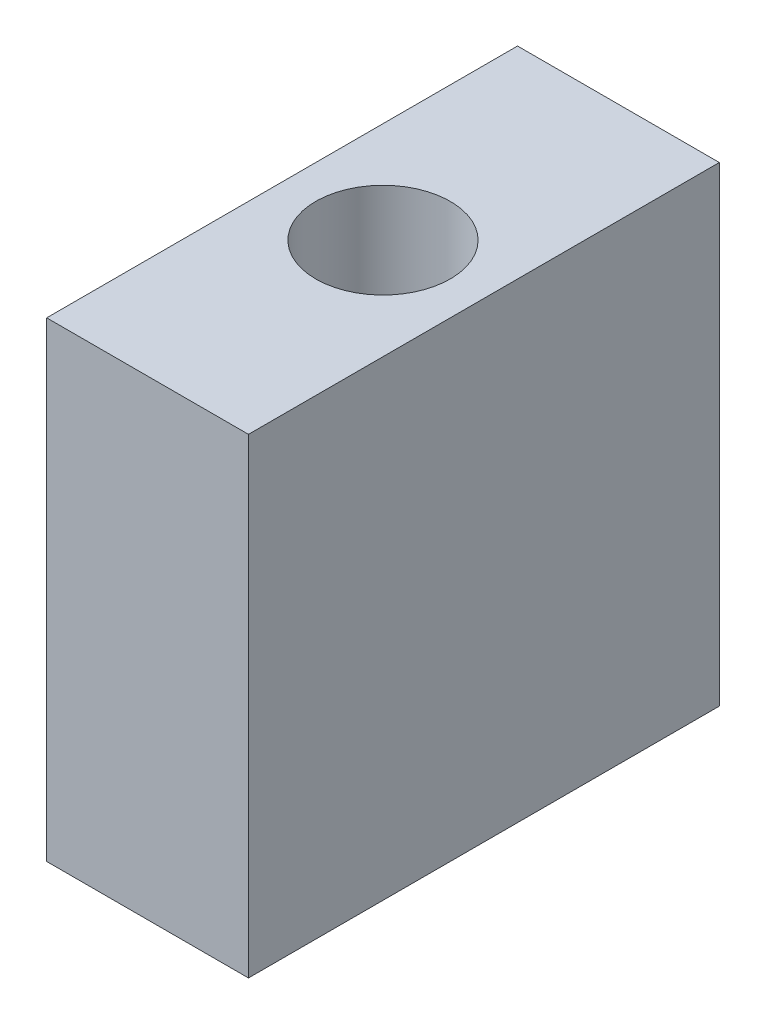
ISO-10303-21;
HEADER;
FILE_DESCRIPTION(('STEP AP214'),'2;1');
FILE_NAME('part.step','',(''),(''),'','','');
FILE_SCHEMA(('AUTOMOTIVE_DESIGN { 1 0 10303 214 1 1 1 1 }'));
ENDSEC;
DATA;
#1=APPLICATION_CONTEXT('core data for automotive mechanical design processes');
#2=APPLICATION_PROTOCOL_DEFINITION('international standard','automotive_design',2000,#1);
#3=PRODUCT_CONTEXT('',#1,'mechanical');
#4=PRODUCT('Part','Part','',(#3));
#5=PRODUCT_RELATED_PRODUCT_CATEGORY('part','',(#4));
#6=PRODUCT_DEFINITION_FORMATION('','',#4);
#7=PRODUCT_DEFINITION_CONTEXT('part definition',#1,'design');
#8=PRODUCT_DEFINITION('design','',#6,#7);
#9=PRODUCT_DEFINITION_SHAPE('','',#8);
#10=(LENGTH_UNIT() NAMED_UNIT(*) SI_UNIT(.MILLI.,.METRE.));
#11=(NAMED_UNIT(*) PLANE_ANGLE_UNIT() SI_UNIT($,.RADIAN.));
#12=(NAMED_UNIT(*) SI_UNIT($,.STERADIAN.) SOLID_ANGLE_UNIT());
#13=UNCERTAINTY_MEASURE_WITH_UNIT(LENGTH_MEASURE(1.E-05),#10,'distance_accuracy_value','');
#14=(GEOMETRIC_REPRESENTATION_CONTEXT(3) GLOBAL_UNCERTAINTY_ASSIGNED_CONTEXT((#13)) GLOBAL_UNIT_ASSIGNED_CONTEXT((#10,
#11,#12)) REPRESENTATION_CONTEXT('',''));
#15=CARTESIAN_POINT('',(0.,0.,0.));
#16=DIRECTION('',(0.,0.,1.));
#17=DIRECTION('',(1.,0.,0.));
#18=AXIS2_PLACEMENT_3D('',#15,#16,#17);
#19=CARTESIAN_POINT('',(0.,7.,0.));
#20=DIRECTION('',(0.,1.,0.));
#21=DIRECTION('',(0.,0.,1.));
#22=AXIS2_PLACEMENT_3D('',#19,#20,#21);
#23=PLANE('',#22);
#24=DIRECTION('',(0.,0.,-1.));
#25=VECTOR('',#24,1.);
#26=CARTESIAN_POINT('',(1.5,7.,-3.5));
#27=LINE('',#26,#25);
#28=CARTESIAN_POINT('',(1.5,7.,3.5));
#29=VERTEX_POINT('',#28);
#30=CARTESIAN_POINT('',(1.5,7.,-3.5));
#31=VERTEX_POINT('',#30);
#32=EDGE_CURVE('E91',#29,#31,#27,.T.);
#33=ORIENTED_EDGE('',*,*,#32,.T.);
#34=DIRECTION('',(-1.,0.,0.));
#35=VECTOR('',#34,1.);
#36=CARTESIAN_POINT('',(-1.5,7.,-3.5));
#37=LINE('',#36,#35);
#38=CARTESIAN_POINT('',(-1.5,7.,-3.5));
#39=VERTEX_POINT('',#38);
#40=EDGE_CURVE('E86',#31,#39,#37,.T.);
#41=ORIENTED_EDGE('',*,*,#40,.T.);
#42=DIRECTION('',(0.,0.,1.));
#43=VECTOR('',#42,1.);
#44=CARTESIAN_POINT('',(-1.5,7.,-3.5));
#45=LINE('',#44,#43);
#46=CARTESIAN_POINT('',(-1.5,7.,3.5));
#47=VERTEX_POINT('',#46);
#48=EDGE_CURVE('E89',#39,#47,#45,.T.);
#49=ORIENTED_EDGE('',*,*,#48,.T.);
#50=DIRECTION('',(1.,0.,0.));
#51=VECTOR('',#50,1.);
#52=CARTESIAN_POINT('',(-1.5,7.,3.5));
#53=LINE('',#52,#51);
#54=EDGE_CURVE('E56',#47,#29,#53,.T.);
#55=ORIENTED_EDGE('',*,*,#54,.T.);
#56=EDGE_LOOP('',(#33,#41,#49,#55));
#57=FACE_BOUND('',#56,.T.);
#58=CARTESIAN_POINT('',(0.,7.,0.));
#59=DIRECTION('',(0.,1.,0.));
#60=DIRECTION('',(0.,0.,1.));
#61=AXIS2_PLACEMENT_3D('',#58,#59,#60);
#62=CIRCLE('',#61,1.);
#63=CARTESIAN_POINT('',(0.,7.,1.));
#64=VERTEX_POINT('',#63);
#65=EDGE_CURVE('E106',#64,#64,#62,.T.);
#66=ORIENTED_EDGE('',*,*,#65,.F.);
#67=EDGE_LOOP('',(#66));
#68=FACE_BOUND('',#67,.T.);
#69=ADVANCED_FACE('F39',(#57,#68),#23,.T.);
#70=CARTESIAN_POINT('',(0.,0.,0.));
#71=DIRECTION('',(0.,1.,0.));
#72=DIRECTION('',(0.,0.,1.));
#73=AXIS2_PLACEMENT_3D('',#70,#71,#72);
#74=PLANE('',#73);
#75=DIRECTION('',(0.,0.,-1.));
#76=VECTOR('',#75,1.);
#77=CARTESIAN_POINT('',(1.5,0.,-3.5));
#78=LINE('',#77,#76);
#79=CARTESIAN_POINT('',(1.5,0.,3.5));
#80=VERTEX_POINT('',#79);
#81=CARTESIAN_POINT('',(1.5,0.,-3.5));
#82=VERTEX_POINT('',#81);
#83=EDGE_CURVE('E103',#80,#82,#78,.T.);
#84=ORIENTED_EDGE('',*,*,#83,.F.);
#85=DIRECTION('',(1.,0.,0.));
#86=VECTOR('',#85,1.);
#87=CARTESIAN_POINT('',(-1.5,0.,3.5));
#88=LINE('',#87,#86);
#89=CARTESIAN_POINT('',(-1.5,0.,3.5));
#90=VERTEX_POINT('',#89);
#91=EDGE_CURVE('E79',#90,#80,#88,.T.);
#92=ORIENTED_EDGE('',*,*,#91,.F.);
#93=DIRECTION('',(0.,0.,1.));
#94=VECTOR('',#93,1.);
#95=CARTESIAN_POINT('',(-1.5,0.,-3.5));
#96=LINE('',#95,#94);
#97=CARTESIAN_POINT('',(-1.5,0.,-3.5));
#98=VERTEX_POINT('',#97);
#99=EDGE_CURVE('E73',#98,#90,#96,.T.);
#100=ORIENTED_EDGE('',*,*,#99,.F.);
#101=DIRECTION('',(-1.,0.,0.));
#102=VECTOR('',#101,1.);
#103=CARTESIAN_POINT('',(-1.5,0.,-3.5));
#104=LINE('',#103,#102);
#105=EDGE_CURVE('E95',#82,#98,#104,.T.);
#106=ORIENTED_EDGE('',*,*,#105,.F.);
#107=EDGE_LOOP('',(#84,#92,#100,#106));
#108=FACE_BOUND('',#107,.T.);
#109=CARTESIAN_POINT('',(0.,0.,0.));
#110=DIRECTION('',(0.,1.,0.));
#111=DIRECTION('',(0.,0.,1.));
#112=AXIS2_PLACEMENT_3D('',#109,#110,#111);
#113=CIRCLE('',#112,1.);
#114=CARTESIAN_POINT('',(0.,0.,1.));
#115=VERTEX_POINT('',#114);
#116=EDGE_CURVE('E118',#115,#115,#113,.T.);
#117=ORIENTED_EDGE('',*,*,#116,.T.);
#118=EDGE_LOOP('',(#117));
#119=FACE_BOUND('',#118,.T.);
#120=ADVANCED_FACE('F114',(#108,#119),#74,.F.);
#121=CARTESIAN_POINT('',(1.5,7.,-3.5));
#122=DIRECTION('',(-1.,0.,0.));
#123=DIRECTION('',(0.,0.,1.));
#124=AXIS2_PLACEMENT_3D('',#121,#122,#123);
#125=PLANE('',#124);
#126=ORIENTED_EDGE('',*,*,#83,.T.);
#127=DIRECTION('',(0.,-1.,0.));
#128=VECTOR('',#127,1.);
#129=CARTESIAN_POINT('',(1.5,7.,-3.5));
#130=LINE('',#129,#128);
#131=EDGE_CURVE('E11',#31,#82,#130,.T.);
#132=ORIENTED_EDGE('',*,*,#131,.F.);
#133=ORIENTED_EDGE('',*,*,#32,.F.);
#134=DIRECTION('',(0.,-1.,0.));
#135=VECTOR('',#134,1.);
#136=CARTESIAN_POINT('',(1.5,7.,3.5));
#137=LINE('',#136,#135);
#138=EDGE_CURVE('E99',#29,#80,#137,.T.);
#139=ORIENTED_EDGE('',*,*,#138,.T.);
#140=EDGE_LOOP('',(#126,#132,#133,#139));
#141=FACE_BOUND('',#140,.T.);
#142=ADVANCED_FACE('F41',(#141),#125,.F.);
#143=CARTESIAN_POINT('',(-1.5,7.,-3.5));
#144=DIRECTION('',(0.,0.,1.));
#145=DIRECTION('',(1.,0.,0.));
#146=AXIS2_PLACEMENT_3D('',#143,#144,#145);
#147=PLANE('',#146);
#148=ORIENTED_EDGE('',*,*,#105,.T.);
#149=DIRECTION('',(0.,-1.,0.));
#150=VECTOR('',#149,1.);
#151=CARTESIAN_POINT('',(-1.5,7.,-3.5));
#152=LINE('',#151,#150);
#153=EDGE_CURVE('E48',#39,#98,#152,.T.);
#154=ORIENTED_EDGE('',*,*,#153,.F.);
#155=ORIENTED_EDGE('',*,*,#40,.F.);
#156=ORIENTED_EDGE('',*,*,#131,.T.);
#157=EDGE_LOOP('',(#148,#154,#155,#156));
#158=FACE_BOUND('',#157,.T.);
#159=ADVANCED_FACE('F94',(#158),#147,.F.);
#160=CARTESIAN_POINT('',(-1.5,7.,-3.5));
#161=DIRECTION('',(1.,0.,0.));
#162=DIRECTION('',(0.,0.,-1.));
#163=AXIS2_PLACEMENT_3D('',#160,#161,#162);
#164=PLANE('',#163);
#165=ORIENTED_EDGE('',*,*,#99,.T.);
#166=DIRECTION('',(0.,-1.,0.));
#167=VECTOR('',#166,1.);
#168=CARTESIAN_POINT('',(-1.5,7.,3.5));
#169=LINE('',#168,#167);
#170=EDGE_CURVE('E96',#47,#90,#169,.T.);
#171=ORIENTED_EDGE('',*,*,#170,.F.);
#172=ORIENTED_EDGE('',*,*,#48,.F.);
#173=ORIENTED_EDGE('',*,*,#153,.T.);
#174=EDGE_LOOP('',(#165,#171,#172,#173));
#175=FACE_BOUND('',#174,.T.);
#176=ADVANCED_FACE('F97',(#175),#164,.F.);
#177=CARTESIAN_POINT('',(-1.5,7.,3.5));
#178=DIRECTION('',(0.,0.,-1.));
#179=DIRECTION('',(-1.,0.,0.));
#180=AXIS2_PLACEMENT_3D('',#177,#178,#179);
#181=PLANE('',#180);
#182=ORIENTED_EDGE('',*,*,#91,.T.);
#183=ORIENTED_EDGE('',*,*,#138,.F.);
#184=ORIENTED_EDGE('',*,*,#54,.F.);
#185=ORIENTED_EDGE('',*,*,#170,.T.);
#186=EDGE_LOOP('',(#182,#183,#184,#185));
#187=FACE_BOUND('',#186,.T.);
#188=ADVANCED_FACE('F111',(#187),#181,.F.);
#189=CARTESIAN_POINT('',(0.,7.,0.));
#190=DIRECTION('',(0.,-1.,0.));
#191=DIRECTION('',(0.,0.,-1.));
#192=AXIS2_PLACEMENT_3D('',#189,#190,#191);
#193=CYLINDRICAL_SURFACE('',#192,1.);
#194=ORIENTED_EDGE('',*,*,#65,.T.);
#195=EDGE_LOOP('',(#194));
#196=FACE_BOUND('',#195,.T.);
#197=ORIENTED_EDGE('',*,*,#116,.F.);
#198=EDGE_LOOP('',(#197));
#199=FACE_BOUND('',#198,.T.);
#200=ADVANCED_FACE('F124',(#196,#199),#193,.F.);
#201=CLOSED_SHELL('',(#69,#120,#142,#159,#176,#188,#200));
#202=MANIFOLD_SOLID_BREP('B2',#201);
#203=ADVANCED_BREP_SHAPE_REPRESENTATION('',(#18,#202),#14);
#204=SHAPE_DEFINITION_REPRESENTATION(#9,#203);
ENDSEC;
END-ISO-10303-21;
